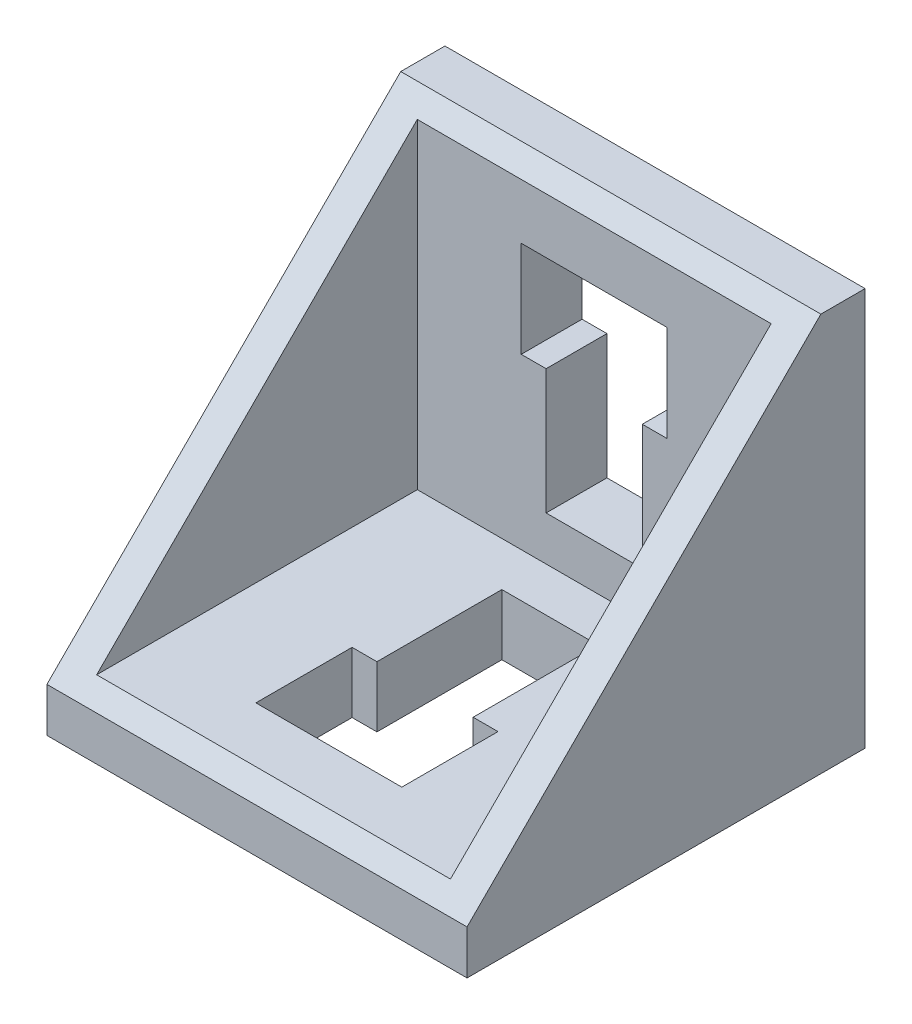
ISO-10303-21;
HEADER;
FILE_DESCRIPTION(('STEP AP214'),'2;1');
FILE_NAME('part.step','',(''),(''),'','','');
FILE_SCHEMA(('AUTOMOTIVE_DESIGN { 1 0 10303 214 1 1 1 1 }'));
ENDSEC;
DATA;
#1=APPLICATION_CONTEXT('core data for automotive mechanical design processes');
#2=APPLICATION_PROTOCOL_DEFINITION('international standard','automotive_design',2000,#1);
#3=PRODUCT_CONTEXT('',#1,'mechanical');
#4=PRODUCT('Part','Part','',(#3));
#5=PRODUCT_RELATED_PRODUCT_CATEGORY('part','',(#4));
#6=PRODUCT_DEFINITION_FORMATION('','',#4);
#7=PRODUCT_DEFINITION_CONTEXT('part definition',#1,'design');
#8=PRODUCT_DEFINITION('design','',#6,#7);
#9=PRODUCT_DEFINITION_SHAPE('','',#8);
#10=(LENGTH_UNIT() NAMED_UNIT(*) SI_UNIT(.MILLI.,.METRE.));
#11=(NAMED_UNIT(*) PLANE_ANGLE_UNIT() SI_UNIT($,.RADIAN.));
#12=(NAMED_UNIT(*) SI_UNIT($,.STERADIAN.) SOLID_ANGLE_UNIT());
#13=UNCERTAINTY_MEASURE_WITH_UNIT(LENGTH_MEASURE(1.E-05),#10,'distance_accuracy_value','');
#14=(GEOMETRIC_REPRESENTATION_CONTEXT(3) GLOBAL_UNCERTAINTY_ASSIGNED_CONTEXT((#13)) GLOBAL_UNIT_ASSIGNED_CONTEXT((#10,
#11,#12)) REPRESENTATION_CONTEXT('',''));
#15=CARTESIAN_POINT('',(0.,0.,0.));
#16=DIRECTION('',(0.,0.,1.));
#17=DIRECTION('',(1.,0.,0.));
#18=AXIS2_PLACEMENT_3D('',#15,#16,#17);
#19=CARTESIAN_POINT('',(38.,20.,-20.));
#20=DIRECTION('',(0.,0.,1.));
#21=DIRECTION('',(0.,-1.,0.));
#22=AXIS2_PLACEMENT_3D('',#19,#20,#21);
#23=PLANE('',#22);
#24=DIRECTION('',(-1.,0.,0.));
#25=VECTOR('',#24,1.);
#26=CARTESIAN_POINT('',(25.6,9.5,-20.));
#27=LINE('',#26,#25);
#28=CARTESIAN_POINT('',(25.6,9.5,-20.));
#29=VERTEX_POINT('',#28);
#30=CARTESIAN_POINT('',(12.4,9.5,-20.));
#31=VERTEX_POINT('',#30);
#32=EDGE_CURVE('E287',#29,#31,#27,.T.);
#33=ORIENTED_EDGE('',*,*,#32,.T.);
#34=DIRECTION('',(0.,-1.,0.));
#35=VECTOR('',#34,1.);
#36=CARTESIAN_POINT('',(12.4,9.5,-20.));
#37=LINE('',#36,#35);
#38=CARTESIAN_POINT('',(12.4,0.799999999999998,-20.));
#39=VERTEX_POINT('',#38);
#40=EDGE_CURVE('E265',#31,#39,#37,.T.);
#41=ORIENTED_EDGE('',*,*,#40,.T.);
#42=DIRECTION('',(1.,0.,0.));
#43=VECTOR('',#42,1.);
#44=CARTESIAN_POINT('',(12.4,0.799999999999998,-20.));
#45=LINE('',#44,#43);
#46=CARTESIAN_POINT('',(14.65,0.799999999999998,-20.));
#47=VERTEX_POINT('',#46);
#48=EDGE_CURVE('E268',#39,#47,#45,.T.);
#49=ORIENTED_EDGE('',*,*,#48,.T.);
#50=DIRECTION('',(0.,-1.,0.));
#51=VECTOR('',#50,1.);
#52=CARTESIAN_POINT('',(14.65,0.799999999999997,-20.));
#53=LINE('',#52,#51);
#54=CARTESIAN_POINT('',(14.65,-10.5,-20.));
#55=VERTEX_POINT('',#54);
#56=EDGE_CURVE('E272',#47,#55,#53,.T.);
#57=ORIENTED_EDGE('',*,*,#56,.T.);
#58=DIRECTION('',(1.,0.,0.));
#59=VECTOR('',#58,1.);
#60=CARTESIAN_POINT('',(14.65,-10.5,-20.));
#61=LINE('',#60,#59);
#62=CARTESIAN_POINT('',(23.35,-10.5,-20.));
#63=VERTEX_POINT('',#62);
#64=EDGE_CURVE('E275',#55,#63,#61,.T.);
#65=ORIENTED_EDGE('',*,*,#64,.T.);
#66=DIRECTION('',(0.,1.,0.));
#67=VECTOR('',#66,1.);
#68=CARTESIAN_POINT('',(23.35,0.799999999999997,-20.));
#69=LINE('',#68,#67);
#70=CARTESIAN_POINT('',(23.35,0.799999999999997,-20.));
#71=VERTEX_POINT('',#70);
#72=EDGE_CURVE('E278',#63,#71,#69,.T.);
#73=ORIENTED_EDGE('',*,*,#72,.T.);
#74=DIRECTION('',(1.,0.,0.));
#75=VECTOR('',#74,1.);
#76=CARTESIAN_POINT('',(25.6,0.799999999999998,-20.));
#77=LINE('',#76,#75);
#78=CARTESIAN_POINT('',(25.6,0.799999999999998,-20.));
#79=VERTEX_POINT('',#78);
#80=EDGE_CURVE('E281',#71,#79,#77,.T.);
#81=ORIENTED_EDGE('',*,*,#80,.T.);
#82=DIRECTION('',(0.,1.,0.));
#83=VECTOR('',#82,1.);
#84=CARTESIAN_POINT('',(25.6,9.5,-20.));
#85=LINE('',#84,#83);
#86=EDGE_CURVE('E284',#79,#29,#85,.T.);
#87=ORIENTED_EDGE('',*,*,#86,.T.);
#88=EDGE_LOOP('',(#33,#41,#49,#57,#65,#73,#81,#87));
#89=FACE_BOUND('',#88,.T.);
#90=DIRECTION('',(-1.,0.,0.));
#91=VECTOR('',#90,1.);
#92=CARTESIAN_POINT('',(38.,16.,-20.));
#93=LINE('',#92,#91);
#94=CARTESIAN_POINT('',(38.,16.,-20.));
#95=VERTEX_POINT('',#94);
#96=CARTESIAN_POINT('',(0.,16.,-20.));
#97=VERTEX_POINT('',#96);
#98=EDGE_CURVE('E331',#95,#97,#93,.T.);
#99=ORIENTED_EDGE('',*,*,#98,.F.);
#100=DIRECTION('',(0.,1.,0.));
#101=VECTOR('',#100,1.);
#102=CARTESIAN_POINT('',(38.,20.,-20.));
#103=LINE('',#102,#101);
#104=CARTESIAN_POINT('',(38.,-20.,-20.));
#105=VERTEX_POINT('',#104);
#106=EDGE_CURVE('E362',#105,#95,#103,.T.);
#107=ORIENTED_EDGE('',*,*,#106,.F.);
#108=DIRECTION('',(-1.,0.,0.));
#109=VECTOR('',#108,1.);
#110=CARTESIAN_POINT('',(38.,-20.,-20.));
#111=LINE('',#110,#109);
#112=CARTESIAN_POINT('',(0.,-20.,-20.));
#113=VERTEX_POINT('',#112);
#114=EDGE_CURVE('E371',#105,#113,#111,.T.);
#115=ORIENTED_EDGE('',*,*,#114,.T.);
#116=DIRECTION('',(0.,1.,0.));
#117=VECTOR('',#116,1.);
#118=CARTESIAN_POINT('',(0.,20.,-20.));
#119=LINE('',#118,#117);
#120=EDGE_CURVE('E361',#113,#97,#119,.T.);
#121=ORIENTED_EDGE('',*,*,#120,.T.);
#122=EDGE_LOOP('',(#99,#107,#115,#121));
#123=FACE_BOUND('',#122,.T.);
#124=ADVANCED_FACE('F36',(#89,#123),#23,.F.);
#125=CARTESIAN_POINT('',(38.,-20.,20.));
#126=DIRECTION('',(0.,-0.707106781186548,-0.707106781186548));
#127=DIRECTION('',(0.,0.707106781186548,-0.707106781186548));
#128=AXIS2_PLACEMENT_3D('',#125,#126,#127);
#129=PLANE('',#128);
#130=DIRECTION('',(1.,0.,0.));
#131=VECTOR('',#130,1.);
#132=CARTESIAN_POINT('',(38.,14.5,-14.5));
#133=LINE('',#132,#131);
#134=CARTESIAN_POINT('',(3.,14.5,-14.5));
#135=VERTEX_POINT('',#134);
#136=CARTESIAN_POINT('',(35.,14.5,-14.5));
#137=VERTEX_POINT('',#136);
#138=EDGE_CURVE('E382',#135,#137,#133,.T.);
#139=ORIENTED_EDGE('',*,*,#138,.T.);
#140=DIRECTION('',(0.,-0.707106781186548,0.707106781186548));
#141=VECTOR('',#140,1.);
#142=CARTESIAN_POINT('',(35.,-20.,20.));
#143=LINE('',#142,#141);
#144=CARTESIAN_POINT('',(35.,-14.5,14.5));
#145=VERTEX_POINT('',#144);
#146=EDGE_CURVE('E12',#137,#145,#143,.T.);
#147=ORIENTED_EDGE('',*,*,#146,.T.);
#148=DIRECTION('',(-1.,0.,0.));
#149=VECTOR('',#148,1.);
#150=CARTESIAN_POINT('',(38.,-14.5,14.5));
#151=LINE('',#150,#149);
#152=CARTESIAN_POINT('',(3.,-14.5,14.5));
#153=VERTEX_POINT('',#152);
#154=EDGE_CURVE('E43',#145,#153,#151,.T.);
#155=ORIENTED_EDGE('',*,*,#154,.T.);
#156=DIRECTION('',(0.,-0.707106781186548,0.707106781186548));
#157=VECTOR('',#156,1.);
#158=CARTESIAN_POINT('',(3.,-20.,20.));
#159=LINE('',#158,#157);
#160=EDGE_CURVE('E380',#135,#153,#159,.T.);
#161=ORIENTED_EDGE('',*,*,#160,.F.);
#162=EDGE_LOOP('',(#139,#147,#155,#161));
#163=FACE_BOUND('',#162,.T.);
#164=DIRECTION('',(-1.,0.,0.));
#165=VECTOR('',#164,1.);
#166=CARTESIAN_POINT('',(38.,16.,-16.));
#167=LINE('',#166,#165);
#168=CARTESIAN_POINT('',(38.,16.,-16.));
#169=VERTEX_POINT('',#168);
#170=CARTESIAN_POINT('',(0.,16.,-16.));
#171=VERTEX_POINT('',#170);
#172=EDGE_CURVE('E337',#169,#171,#167,.T.);
#173=ORIENTED_EDGE('',*,*,#172,.T.);
#174=DIRECTION('',(0.,-0.707106781186548,0.707106781186547));
#175=VECTOR('',#174,1.);
#176=CARTESIAN_POINT('',(0.,-20.,20.));
#177=LINE('',#176,#175);
#178=CARTESIAN_POINT('',(0.,-16.,16.));
#179=VERTEX_POINT('',#178);
#180=EDGE_CURVE('E374',#171,#179,#177,.T.);
#181=ORIENTED_EDGE('',*,*,#180,.T.);
#182=DIRECTION('',(-1.,0.,0.));
#183=VECTOR('',#182,1.);
#184=CARTESIAN_POINT('',(38.,-16.,16.));
#185=LINE('',#184,#183);
#186=CARTESIAN_POINT('',(38.,-16.,16.));
#187=VERTEX_POINT('',#186);
#188=EDGE_CURVE('E343',#187,#179,#185,.T.);
#189=ORIENTED_EDGE('',*,*,#188,.F.);
#190=DIRECTION('',(0.,-0.707106781186548,0.707106781186547));
#191=VECTOR('',#190,1.);
#192=CARTESIAN_POINT('',(38.,-20.,20.));
#193=LINE('',#192,#191);
#194=EDGE_CURVE('E365',#169,#187,#193,.T.);
#195=ORIENTED_EDGE('',*,*,#194,.F.);
#196=EDGE_LOOP('',(#173,#181,#189,#195));
#197=FACE_BOUND('',#196,.T.);
#198=ADVANCED_FACE('F387',(#163,#197),#129,.F.);
#199=CARTESIAN_POINT('',(38.,-20.,20.));
#200=DIRECTION('',(0.,1.,0.));
#201=DIRECTION('',(0.,0.,1.));
#202=AXIS2_PLACEMENT_3D('',#199,#200,#201);
#203=PLANE('',#202);
#204=DIRECTION('',(-1.,0.,0.));
#205=VECTOR('',#204,1.);
#206=CARTESIAN_POINT('',(12.4,-20.,0.79999999999999));
#207=LINE('',#206,#205);
#208=CARTESIAN_POINT('',(14.65,-20.,0.79999999999999));
#209=VERTEX_POINT('',#208);
#210=CARTESIAN_POINT('',(12.4,-20.,0.79999999999999));
#211=VERTEX_POINT('',#210);
#212=EDGE_CURVE('E204',#209,#211,#207,.T.);
#213=ORIENTED_EDGE('',*,*,#212,.T.);
#214=DIRECTION('',(0.,0.,1.));
#215=VECTOR('',#214,1.);
#216=CARTESIAN_POINT('',(12.4,-20.,9.49999999999999));
#217=LINE('',#216,#215);
#218=CARTESIAN_POINT('',(12.4,-20.,9.49999999999999));
#219=VERTEX_POINT('',#218);
#220=EDGE_CURVE('E198',#211,#219,#217,.T.);
#221=ORIENTED_EDGE('',*,*,#220,.T.);
#222=DIRECTION('',(1.,0.,0.));
#223=VECTOR('',#222,1.);
#224=CARTESIAN_POINT('',(25.6,-20.,9.49999999999999));
#225=LINE('',#224,#223);
#226=CARTESIAN_POINT('',(25.6,-20.,9.49999999999999));
#227=VERTEX_POINT('',#226);
#228=EDGE_CURVE('E207',#219,#227,#225,.T.);
#229=ORIENTED_EDGE('',*,*,#228,.T.);
#230=DIRECTION('',(0.,0.,-1.));
#231=VECTOR('',#230,1.);
#232=CARTESIAN_POINT('',(25.6,-20.,9.49999999999999));
#233=LINE('',#232,#231);
#234=CARTESIAN_POINT('',(25.6,-20.,0.79999999999999));
#235=VERTEX_POINT('',#234);
#236=EDGE_CURVE('E50',#227,#235,#233,.T.);
#237=ORIENTED_EDGE('',*,*,#236,.T.);
#238=DIRECTION('',(-1.,0.,0.));
#239=VECTOR('',#238,1.);
#240=CARTESIAN_POINT('',(25.6,-20.,0.79999999999999));
#241=LINE('',#240,#239);
#242=CARTESIAN_POINT('',(23.35,-20.,0.79999999999999));
#243=VERTEX_POINT('',#242);
#244=EDGE_CURVE('E222',#235,#243,#241,.T.);
#245=ORIENTED_EDGE('',*,*,#244,.T.);
#246=DIRECTION('',(0.,0.,-1.));
#247=VECTOR('',#246,1.);
#248=CARTESIAN_POINT('',(23.35,-20.,0.79999999999999));
#249=LINE('',#248,#247);
#250=CARTESIAN_POINT('',(23.35,-20.,-10.5));
#251=VERTEX_POINT('',#250);
#252=EDGE_CURVE('E225',#243,#251,#249,.T.);
#253=ORIENTED_EDGE('',*,*,#252,.T.);
#254=DIRECTION('',(-1.,0.,0.));
#255=VECTOR('',#254,1.);
#256=CARTESIAN_POINT('',(14.65,-20.,-10.5));
#257=LINE('',#256,#255);
#258=CARTESIAN_POINT('',(14.65,-20.,-10.5));
#259=VERTEX_POINT('',#258);
#260=EDGE_CURVE('E228',#251,#259,#257,.T.);
#261=ORIENTED_EDGE('',*,*,#260,.T.);
#262=DIRECTION('',(0.,0.,1.));
#263=VECTOR('',#262,1.);
#264=CARTESIAN_POINT('',(14.65,-20.,0.79999999999999));
#265=LINE('',#264,#263);
#266=EDGE_CURVE('E231',#259,#209,#265,.T.);
#267=ORIENTED_EDGE('',*,*,#266,.T.);
#268=EDGE_LOOP('',(#213,#221,#229,#237,#245,#253,#261,#267));
#269=FACE_BOUND('',#268,.T.);
#270=DIRECTION('',(-1.,0.,0.));
#271=VECTOR('',#270,1.);
#272=CARTESIAN_POINT('',(38.,-20.,16.));
#273=LINE('',#272,#271);
#274=CARTESIAN_POINT('',(38.,-20.,16.));
#275=VERTEX_POINT('',#274);
#276=CARTESIAN_POINT('',(0.,-20.,16.));
#277=VERTEX_POINT('',#276);
#278=EDGE_CURVE('E335',#275,#277,#273,.T.);
#279=ORIENTED_EDGE('',*,*,#278,.T.);
#280=DIRECTION('',(0.,0.,-1.));
#281=VECTOR('',#280,1.);
#282=CARTESIAN_POINT('',(0.,-20.,20.));
#283=LINE('',#282,#281);
#284=EDGE_CURVE('E366',#277,#113,#283,.T.);
#285=ORIENTED_EDGE('',*,*,#284,.T.);
#286=ORIENTED_EDGE('',*,*,#114,.F.);
#287=DIRECTION('',(0.,0.,-1.));
#288=VECTOR('',#287,1.);
#289=CARTESIAN_POINT('',(38.,-20.,20.));
#290=LINE('',#289,#288);
#291=EDGE_CURVE('E369',#275,#105,#290,.T.);
#292=ORIENTED_EDGE('',*,*,#291,.F.);
#293=EDGE_LOOP('',(#279,#285,#286,#292));
#294=FACE_BOUND('',#293,.T.);
#295=ADVANCED_FACE('F211',(#269,#294),#203,.F.);
#296=CARTESIAN_POINT('',(38.,0.,0.));
#297=DIRECTION('',(1.,0.,0.));
#298=DIRECTION('',(0.,0.,-1.));
#299=AXIS2_PLACEMENT_3D('',#296,#297,#298);
#300=PLANE('',#299);
#301=ORIENTED_EDGE('',*,*,#106,.T.);
#302=DIRECTION('',(0.,0.,-1.));
#303=VECTOR('',#302,1.);
#304=CARTESIAN_POINT('',(38.,16.,-16.));
#305=LINE('',#304,#303);
#306=EDGE_CURVE('E329',#169,#95,#305,.T.);
#307=ORIENTED_EDGE('',*,*,#306,.F.);
#308=ORIENTED_EDGE('',*,*,#194,.T.);
#309=DIRECTION('',(0.,1.,0.));
#310=VECTOR('',#309,1.);
#311=CARTESIAN_POINT('',(38.,-16.,16.));
#312=LINE('',#311,#310);
#313=EDGE_CURVE('E341',#275,#187,#312,.T.);
#314=ORIENTED_EDGE('',*,*,#313,.F.);
#315=ORIENTED_EDGE('',*,*,#291,.T.);
#316=EDGE_LOOP('',(#301,#307,#308,#314,#315));
#317=FACE_BOUND('',#316,.T.);
#318=ADVANCED_FACE('F426',(#317),#300,.T.);
#319=CARTESIAN_POINT('',(0.,0.,0.));
#320=DIRECTION('',(1.,0.,0.));
#321=DIRECTION('',(0.,0.,-1.));
#322=AXIS2_PLACEMENT_3D('',#319,#320,#321);
#323=PLANE('',#322);
#324=DIRECTION('',(0.,0.,-1.));
#325=VECTOR('',#324,1.);
#326=CARTESIAN_POINT('',(0.,16.,-16.));
#327=LINE('',#326,#325);
#328=EDGE_CURVE('E332',#171,#97,#327,.T.);
#329=ORIENTED_EDGE('',*,*,#328,.T.);
#330=ORIENTED_EDGE('',*,*,#120,.F.);
#331=ORIENTED_EDGE('',*,*,#284,.F.);
#332=DIRECTION('',(0.,1.,0.));
#333=VECTOR('',#332,1.);
#334=CARTESIAN_POINT('',(0.,-16.,16.));
#335=LINE('',#334,#333);
#336=EDGE_CURVE('E314',#277,#179,#335,.T.);
#337=ORIENTED_EDGE('',*,*,#336,.T.);
#338=ORIENTED_EDGE('',*,*,#180,.F.);
#339=EDGE_LOOP('',(#329,#330,#331,#337,#338));
#340=FACE_BOUND('',#339,.T.);
#341=ADVANCED_FACE('F433',(#340),#323,.F.);
#342=CARTESIAN_POINT('',(-48.7903679018718,-14.5,20.));
#343=DIRECTION('',(0.,-1.,0.));
#344=DIRECTION('',(0.,0.,-1.));
#345=AXIS2_PLACEMENT_3D('',#342,#343,#344);
#346=PLANE('',#345);
#347=DIRECTION('',(1.,0.,0.));
#348=VECTOR('',#347,1.);
#349=CARTESIAN_POINT('',(25.6,-14.5,9.49999999999999));
#350=LINE('',#349,#348);
#351=CARTESIAN_POINT('',(12.4,-14.5,9.49999999999999));
#352=VERTEX_POINT('',#351);
#353=CARTESIAN_POINT('',(25.6,-14.5,9.49999999999999));
#354=VERTEX_POINT('',#353);
#355=EDGE_CURVE('E235',#352,#354,#350,.T.);
#356=ORIENTED_EDGE('',*,*,#355,.F.);
#357=DIRECTION('',(0.,0.,1.));
#358=VECTOR('',#357,1.);
#359=CARTESIAN_POINT('',(12.4,-14.5,9.49999999999999));
#360=LINE('',#359,#358);
#361=CARTESIAN_POINT('',(12.4,-14.5,0.79999999999999));
#362=VERTEX_POINT('',#361);
#363=EDGE_CURVE('E58',#362,#352,#360,.T.);
#364=ORIENTED_EDGE('',*,*,#363,.F.);
#365=DIRECTION('',(-1.,0.,0.));
#366=VECTOR('',#365,1.);
#367=CARTESIAN_POINT('',(12.4,-14.5,0.79999999999999));
#368=LINE('',#367,#366);
#369=CARTESIAN_POINT('',(14.65,-14.5,0.79999999999999));
#370=VERTEX_POINT('',#369);
#371=EDGE_CURVE('E215',#370,#362,#368,.T.);
#372=ORIENTED_EDGE('',*,*,#371,.F.);
#373=DIRECTION('',(0.,0.,1.));
#374=VECTOR('',#373,1.);
#375=CARTESIAN_POINT('',(14.65,-14.5,0.79999999999999));
#376=LINE('',#375,#374);
#377=CARTESIAN_POINT('',(14.65,-14.5,-10.5));
#378=VERTEX_POINT('',#377);
#379=EDGE_CURVE('E218',#378,#370,#376,.T.);
#380=ORIENTED_EDGE('',*,*,#379,.F.);
#381=DIRECTION('',(-1.,0.,0.));
#382=VECTOR('',#381,1.);
#383=CARTESIAN_POINT('',(14.65,-14.5,-10.5));
#384=LINE('',#383,#382);
#385=CARTESIAN_POINT('',(23.35,-14.5,-10.5));
#386=VERTEX_POINT('',#385);
#387=EDGE_CURVE('E246',#386,#378,#384,.T.);
#388=ORIENTED_EDGE('',*,*,#387,.F.);
#389=DIRECTION('',(0.,0.,-1.));
#390=VECTOR('',#389,1.);
#391=CARTESIAN_POINT('',(23.35,-14.5,0.79999999999999));
#392=LINE('',#391,#390);
#393=CARTESIAN_POINT('',(23.35,-14.5,0.79999999999999));
#394=VERTEX_POINT('',#393);
#395=EDGE_CURVE('E243',#394,#386,#392,.T.);
#396=ORIENTED_EDGE('',*,*,#395,.F.);
#397=DIRECTION('',(-1.,0.,0.));
#398=VECTOR('',#397,1.);
#399=CARTESIAN_POINT('',(25.6,-14.5,0.79999999999999));
#400=LINE('',#399,#398);
#401=CARTESIAN_POINT('',(25.6,-14.5,0.79999999999999));
#402=VERTEX_POINT('',#401);
#403=EDGE_CURVE('E240',#402,#394,#400,.T.);
#404=ORIENTED_EDGE('',*,*,#403,.F.);
#405=DIRECTION('',(0.,0.,-1.));
#406=VECTOR('',#405,1.);
#407=CARTESIAN_POINT('',(25.6,-14.5,9.49999999999999));
#408=LINE('',#407,#406);
#409=EDGE_CURVE('E237',#354,#402,#408,.T.);
#410=ORIENTED_EDGE('',*,*,#409,.F.);
#411=EDGE_LOOP('',(#356,#364,#372,#380,#388,#396,#404,#410));
#412=FACE_BOUND('',#411,.T.);
#413=DIRECTION('',(0.,0.,-1.));
#414=VECTOR('',#413,1.);
#415=CARTESIAN_POINT('',(35.,-14.5,20.));
#416=LINE('',#415,#414);
#417=CARTESIAN_POINT('',(35.,-14.5,-14.5));
#418=VERTEX_POINT('',#417);
#419=EDGE_CURVE('E340',#145,#418,#416,.T.);
#420=ORIENTED_EDGE('',*,*,#419,.T.);
#421=DIRECTION('',(1.,0.,0.));
#422=VECTOR('',#421,1.);
#423=CARTESIAN_POINT('',(-48.7903679018718,-14.5,-14.5));
#424=LINE('',#423,#422);
#425=CARTESIAN_POINT('',(3.,-14.5,-14.5));
#426=VERTEX_POINT('',#425);
#427=EDGE_CURVE('E353',#426,#418,#424,.T.);
#428=ORIENTED_EDGE('',*,*,#427,.F.);
#429=DIRECTION('',(0.,0.,1.));
#430=VECTOR('',#429,1.);
#431=CARTESIAN_POINT('',(3.,-14.5,20.));
#432=LINE('',#431,#430);
#433=EDGE_CURVE('E349',#426,#153,#432,.T.);
#434=ORIENTED_EDGE('',*,*,#433,.T.);
#435=ORIENTED_EDGE('',*,*,#154,.F.);
#436=EDGE_LOOP('',(#420,#428,#434,#435));
#437=FACE_BOUND('',#436,.T.);
#438=ADVANCED_FACE('F391',(#412,#437),#346,.F.);
#439=CARTESIAN_POINT('',(-48.7903679018718,-14.5,-14.5));
#440=DIRECTION('',(0.,0.,-1.));
#441=DIRECTION('',(0.,1.,0.));
#442=AXIS2_PLACEMENT_3D('',#439,#440,#441);
#443=PLANE('',#442);
#444=DIRECTION('',(1.,0.,0.));
#445=VECTOR('',#444,1.);
#446=CARTESIAN_POINT('',(12.4,0.799999999999998,-14.5));
#447=LINE('',#446,#445);
#448=CARTESIAN_POINT('',(12.4,0.799999999999998,-14.5));
#449=VERTEX_POINT('',#448);
#450=CARTESIAN_POINT('',(14.65,0.799999999999997,-14.5));
#451=VERTEX_POINT('',#450);
#452=EDGE_CURVE('E292',#449,#451,#447,.T.);
#453=ORIENTED_EDGE('',*,*,#452,.F.);
#454=DIRECTION('',(0.,-1.,0.));
#455=VECTOR('',#454,1.);
#456=CARTESIAN_POINT('',(12.4,9.5,-14.5));
#457=LINE('',#456,#455);
#458=CARTESIAN_POINT('',(12.4,9.5,-14.5));
#459=VERTEX_POINT('',#458);
#460=EDGE_CURVE('E253',#459,#449,#457,.T.);
#461=ORIENTED_EDGE('',*,*,#460,.F.);
#462=DIRECTION('',(-1.,0.,0.));
#463=VECTOR('',#462,1.);
#464=CARTESIAN_POINT('',(25.6,9.5,-14.5));
#465=LINE('',#464,#463);
#466=CARTESIAN_POINT('',(25.6,9.5,-14.5));
#467=VERTEX_POINT('',#466);
#468=EDGE_CURVE('E269',#467,#459,#465,.T.);
#469=ORIENTED_EDGE('',*,*,#468,.F.);
#470=DIRECTION('',(0.,1.,0.));
#471=VECTOR('',#470,1.);
#472=CARTESIAN_POINT('',(25.6,9.5,-14.5));
#473=LINE('',#472,#471);
#474=CARTESIAN_POINT('',(25.6,0.799999999999998,-14.5));
#475=VERTEX_POINT('',#474);
#476=EDGE_CURVE('E307',#475,#467,#473,.T.);
#477=ORIENTED_EDGE('',*,*,#476,.F.);
#478=DIRECTION('',(1.,0.,0.));
#479=VECTOR('',#478,1.);
#480=CARTESIAN_POINT('',(25.6,0.799999999999998,-14.5));
#481=LINE('',#480,#479);
#482=CARTESIAN_POINT('',(23.35,0.799999999999997,-14.5));
#483=VERTEX_POINT('',#482);
#484=EDGE_CURVE('E304',#483,#475,#481,.T.);
#485=ORIENTED_EDGE('',*,*,#484,.F.);
#486=DIRECTION('',(0.,1.,0.));
#487=VECTOR('',#486,1.);
#488=CARTESIAN_POINT('',(23.35,0.799999999999997,-14.5));
#489=LINE('',#488,#487);
#490=CARTESIAN_POINT('',(23.35,-10.5,-14.5));
#491=VERTEX_POINT('',#490);
#492=EDGE_CURVE('E301',#491,#483,#489,.T.);
#493=ORIENTED_EDGE('',*,*,#492,.F.);
#494=DIRECTION('',(1.,0.,0.));
#495=VECTOR('',#494,1.);
#496=CARTESIAN_POINT('',(14.65,-10.5,-14.5));
#497=LINE('',#496,#495);
#498=CARTESIAN_POINT('',(14.65,-10.5,-14.5));
#499=VERTEX_POINT('',#498);
#500=EDGE_CURVE('E298',#499,#491,#497,.T.);
#501=ORIENTED_EDGE('',*,*,#500,.F.);
#502=DIRECTION('',(0.,-1.,0.));
#503=VECTOR('',#502,1.);
#504=CARTESIAN_POINT('',(14.65,0.799999999999997,-14.5));
#505=LINE('',#504,#503);
#506=EDGE_CURVE('E295',#451,#499,#505,.T.);
#507=ORIENTED_EDGE('',*,*,#506,.F.);
#508=EDGE_LOOP('',(#453,#461,#469,#477,#485,#493,#501,#507));
#509=FACE_BOUND('',#508,.T.);
#510=DIRECTION('',(0.,-1.,0.));
#511=VECTOR('',#510,1.);
#512=CARTESIAN_POINT('',(3.,-14.5,-14.5));
#513=LINE('',#512,#511);
#514=EDGE_CURVE('E352',#135,#426,#513,.T.);
#515=ORIENTED_EDGE('',*,*,#514,.T.);
#516=ORIENTED_EDGE('',*,*,#427,.T.);
#517=DIRECTION('',(0.,1.,0.));
#518=VECTOR('',#517,1.);
#519=CARTESIAN_POINT('',(35.,-14.5,-14.5));
#520=LINE('',#519,#518);
#521=EDGE_CURVE('E355',#418,#137,#520,.T.);
#522=ORIENTED_EDGE('',*,*,#521,.T.);
#523=ORIENTED_EDGE('',*,*,#138,.F.);
#524=EDGE_LOOP('',(#515,#516,#522,#523));
#525=FACE_BOUND('',#524,.T.);
#526=ADVANCED_FACE('F399',(#509,#525),#443,.F.);
#527=CARTESIAN_POINT('',(35.,0.,0.));
#528=DIRECTION('',(1.,0.,0.));
#529=DIRECTION('',(0.,0.,-1.));
#530=AXIS2_PLACEMENT_3D('',#527,#528,#529);
#531=PLANE('',#530);
#532=ORIENTED_EDGE('',*,*,#521,.F.);
#533=ORIENTED_EDGE('',*,*,#419,.F.);
#534=ORIENTED_EDGE('',*,*,#146,.F.);
#535=EDGE_LOOP('',(#532,#533,#534));
#536=FACE_BOUND('',#535,.T.);
#537=ADVANCED_FACE('F396',(#536),#531,.F.);
#538=CARTESIAN_POINT('',(3.,0.,0.));
#539=DIRECTION('',(1.,0.,0.));
#540=DIRECTION('',(0.,0.,-1.));
#541=AXIS2_PLACEMENT_3D('',#538,#539,#540);
#542=PLANE('',#541);
#543=ORIENTED_EDGE('',*,*,#160,.T.);
#544=ORIENTED_EDGE('',*,*,#433,.F.);
#545=ORIENTED_EDGE('',*,*,#514,.F.);
#546=EDGE_LOOP('',(#543,#544,#545));
#547=FACE_BOUND('',#546,.T.);
#548=ADVANCED_FACE('F401',(#547),#542,.T.);
#549=CARTESIAN_POINT('',(38.,-16.,16.));
#550=DIRECTION('',(0.,0.,1.));
#551=DIRECTION('',(1.,0.,0.));
#552=AXIS2_PLACEMENT_3D('',#549,#550,#551);
#553=PLANE('',#552);
#554=ORIENTED_EDGE('',*,*,#336,.F.);
#555=ORIENTED_EDGE('',*,*,#278,.F.);
#556=ORIENTED_EDGE('',*,*,#313,.T.);
#557=ORIENTED_EDGE('',*,*,#188,.T.);
#558=EDGE_LOOP('',(#554,#555,#556,#557));
#559=FACE_BOUND('',#558,.T.);
#560=ADVANCED_FACE('F403',(#559),#553,.T.);
#561=CARTESIAN_POINT('',(38.,16.,-16.));
#562=DIRECTION('',(0.,1.,0.));
#563=DIRECTION('',(0.,0.,1.));
#564=AXIS2_PLACEMENT_3D('',#561,#562,#563);
#565=PLANE('',#564);
#566=ORIENTED_EDGE('',*,*,#328,.F.);
#567=ORIENTED_EDGE('',*,*,#172,.F.);
#568=ORIENTED_EDGE('',*,*,#306,.T.);
#569=ORIENTED_EDGE('',*,*,#98,.T.);
#570=EDGE_LOOP('',(#566,#567,#568,#569));
#571=FACE_BOUND('',#570,.T.);
#572=ADVANCED_FACE('F409',(#571),#565,.T.);
#573=CARTESIAN_POINT('',(12.4,9.5,-20.));
#574=DIRECTION('',(-1.,0.,0.));
#575=DIRECTION('',(0.,-1.,0.));
#576=AXIS2_PLACEMENT_3D('',#573,#574,#575);
#577=PLANE('',#576);
#578=ORIENTED_EDGE('',*,*,#460,.T.);
#579=DIRECTION('',(0.,0.,1.));
#580=VECTOR('',#579,1.);
#581=CARTESIAN_POINT('',(12.4,0.799999999999998,-20.));
#582=LINE('',#581,#580);
#583=EDGE_CURVE('E290',#39,#449,#582,.T.);
#584=ORIENTED_EDGE('',*,*,#583,.F.);
#585=ORIENTED_EDGE('',*,*,#40,.F.);
#586=DIRECTION('',(0.,0.,1.));
#587=VECTOR('',#586,1.);
#588=CARTESIAN_POINT('',(12.4,9.5,-20.));
#589=LINE('',#588,#587);
#590=EDGE_CURVE('E312',#31,#459,#589,.T.);
#591=ORIENTED_EDGE('',*,*,#590,.T.);
#592=EDGE_LOOP('',(#578,#584,#585,#591));
#593=FACE_BOUND('',#592,.T.);
#594=ADVANCED_FACE('F437',(#593),#577,.F.);
#595=CARTESIAN_POINT('',(25.6,9.5,-20.));
#596=DIRECTION('',(0.,1.,0.));
#597=DIRECTION('',(0.,0.,1.));
#598=AXIS2_PLACEMENT_3D('',#595,#596,#597);
#599=PLANE('',#598);
#600=ORIENTED_EDGE('',*,*,#468,.T.);
#601=ORIENTED_EDGE('',*,*,#590,.F.);
#602=ORIENTED_EDGE('',*,*,#32,.F.);
#603=DIRECTION('',(0.,0.,1.));
#604=VECTOR('',#603,1.);
#605=CARTESIAN_POINT('',(25.6,9.5,-20.));
#606=LINE('',#605,#604);
#607=EDGE_CURVE('E315',#29,#467,#606,.T.);
#608=ORIENTED_EDGE('',*,*,#607,.T.);
#609=EDGE_LOOP('',(#600,#601,#602,#608));
#610=FACE_BOUND('',#609,.T.);
#611=ADVANCED_FACE('F442',(#610),#599,.F.);
#612=CARTESIAN_POINT('',(25.6,9.5,-20.));
#613=DIRECTION('',(1.,0.,0.));
#614=DIRECTION('',(0.,0.,-1.));
#615=AXIS2_PLACEMENT_3D('',#612,#613,#614);
#616=PLANE('',#615);
#617=ORIENTED_EDGE('',*,*,#476,.T.);
#618=ORIENTED_EDGE('',*,*,#607,.F.);
#619=ORIENTED_EDGE('',*,*,#86,.F.);
#620=DIRECTION('',(0.,0.,1.));
#621=VECTOR('',#620,1.);
#622=CARTESIAN_POINT('',(25.6,0.799999999999998,-20.));
#623=LINE('',#622,#621);
#624=EDGE_CURVE('E317',#79,#475,#623,.T.);
#625=ORIENTED_EDGE('',*,*,#624,.T.);
#626=EDGE_LOOP('',(#617,#618,#619,#625));
#627=FACE_BOUND('',#626,.T.);
#628=ADVANCED_FACE('F465',(#627),#616,.F.);
#629=CARTESIAN_POINT('',(25.6,0.799999999999998,-20.));
#630=DIRECTION('',(0.,-1.,0.));
#631=DIRECTION('',(1.,0.,0.));
#632=AXIS2_PLACEMENT_3D('',#629,#630,#631);
#633=PLANE('',#632);
#634=ORIENTED_EDGE('',*,*,#484,.T.);
#635=ORIENTED_EDGE('',*,*,#624,.F.);
#636=ORIENTED_EDGE('',*,*,#80,.F.);
#637=DIRECTION('',(0.,0.,1.));
#638=VECTOR('',#637,1.);
#639=CARTESIAN_POINT('',(23.35,0.799999999999997,-20.));
#640=LINE('',#639,#638);
#641=EDGE_CURVE('E319',#71,#483,#640,.T.);
#642=ORIENTED_EDGE('',*,*,#641,.T.);
#643=EDGE_LOOP('',(#634,#635,#636,#642));
#644=FACE_BOUND('',#643,.T.);
#645=ADVANCED_FACE('F461',(#644),#633,.F.);
#646=CARTESIAN_POINT('',(23.35,0.799999999999997,-20.));
#647=DIRECTION('',(1.,0.,0.));
#648=DIRECTION('',(0.,1.,0.));
#649=AXIS2_PLACEMENT_3D('',#646,#647,#648);
#650=PLANE('',#649);
#651=ORIENTED_EDGE('',*,*,#492,.T.);
#652=ORIENTED_EDGE('',*,*,#641,.F.);
#653=ORIENTED_EDGE('',*,*,#72,.F.);
#654=DIRECTION('',(0.,0.,1.));
#655=VECTOR('',#654,1.);
#656=CARTESIAN_POINT('',(23.35,-10.5,-20.));
#657=LINE('',#656,#655);
#658=EDGE_CURVE('E321',#63,#491,#657,.T.);
#659=ORIENTED_EDGE('',*,*,#658,.T.);
#660=EDGE_LOOP('',(#651,#652,#653,#659));
#661=FACE_BOUND('',#660,.T.);
#662=ADVANCED_FACE('F457',(#661),#650,.F.);
#663=CARTESIAN_POINT('',(14.65,-10.5,-20.));
#664=DIRECTION('',(0.,-1.,0.));
#665=DIRECTION('',(0.,0.,-1.));
#666=AXIS2_PLACEMENT_3D('',#663,#664,#665);
#667=PLANE('',#666);
#668=ORIENTED_EDGE('',*,*,#500,.T.);
#669=ORIENTED_EDGE('',*,*,#658,.F.);
#670=ORIENTED_EDGE('',*,*,#64,.F.);
#671=DIRECTION('',(0.,0.,1.));
#672=VECTOR('',#671,1.);
#673=CARTESIAN_POINT('',(14.65,-10.5,-20.));
#674=LINE('',#673,#672);
#675=EDGE_CURVE('E323',#55,#499,#674,.T.);
#676=ORIENTED_EDGE('',*,*,#675,.T.);
#677=EDGE_LOOP('',(#668,#669,#670,#676));
#678=FACE_BOUND('',#677,.T.);
#679=ADVANCED_FACE('F453',(#678),#667,.F.);
#680=CARTESIAN_POINT('',(14.65,0.799999999999997,-20.));
#681=DIRECTION('',(-1.,0.,0.));
#682=DIRECTION('',(0.,-1.,0.));
#683=AXIS2_PLACEMENT_3D('',#680,#681,#682);
#684=PLANE('',#683);
#685=ORIENTED_EDGE('',*,*,#506,.T.);
#686=ORIENTED_EDGE('',*,*,#675,.F.);
#687=ORIENTED_EDGE('',*,*,#56,.F.);
#688=DIRECTION('',(0.,0.,1.));
#689=VECTOR('',#688,1.);
#690=CARTESIAN_POINT('',(14.65,0.799999999999997,-20.));
#691=LINE('',#690,#689);
#692=EDGE_CURVE('E325',#47,#451,#691,.T.);
#693=ORIENTED_EDGE('',*,*,#692,.T.);
#694=EDGE_LOOP('',(#685,#686,#687,#693));
#695=FACE_BOUND('',#694,.T.);
#696=ADVANCED_FACE('F449',(#695),#684,.F.);
#697=CARTESIAN_POINT('',(12.4,0.799999999999998,-20.));
#698=DIRECTION('',(0.,-1.,0.));
#699=DIRECTION('',(1.,0.,0.));
#700=AXIS2_PLACEMENT_3D('',#697,#698,#699);
#701=PLANE('',#700);
#702=ORIENTED_EDGE('',*,*,#452,.T.);
#703=ORIENTED_EDGE('',*,*,#692,.F.);
#704=ORIENTED_EDGE('',*,*,#48,.F.);
#705=ORIENTED_EDGE('',*,*,#583,.T.);
#706=EDGE_LOOP('',(#702,#703,#704,#705));
#707=FACE_BOUND('',#706,.T.);
#708=ADVANCED_FACE('F446',(#707),#701,.F.);
#709=CARTESIAN_POINT('',(12.4,-20.,9.49999999999999));
#710=DIRECTION('',(-1.,0.,0.));
#711=DIRECTION('',(0.,0.,1.));
#712=AXIS2_PLACEMENT_3D('',#709,#710,#711);
#713=PLANE('',#712);
#714=ORIENTED_EDGE('',*,*,#363,.T.);
#715=DIRECTION('',(0.,1.,0.));
#716=VECTOR('',#715,1.);
#717=CARTESIAN_POINT('',(12.4,-20.,9.49999999999999));
#718=LINE('',#717,#716);
#719=EDGE_CURVE('E194',#219,#352,#718,.T.);
#720=ORIENTED_EDGE('',*,*,#719,.F.);
#721=ORIENTED_EDGE('',*,*,#220,.F.);
#722=DIRECTION('',(0.,1.,0.));
#723=VECTOR('',#722,1.);
#724=CARTESIAN_POINT('',(12.4,-20.,0.79999999999999));
#725=LINE('',#724,#723);
#726=EDGE_CURVE('E251',#211,#362,#725,.T.);
#727=ORIENTED_EDGE('',*,*,#726,.T.);
#728=EDGE_LOOP('',(#714,#720,#721,#727));
#729=FACE_BOUND('',#728,.T.);
#730=ADVANCED_FACE('F196',(#729),#713,.F.);
#731=CARTESIAN_POINT('',(12.4,-20.,0.79999999999999));
#732=DIRECTION('',(0.,0.,-1.));
#733=DIRECTION('',(-1.,0.,0.));
#734=AXIS2_PLACEMENT_3D('',#731,#732,#733);
#735=PLANE('',#734);
#736=ORIENTED_EDGE('',*,*,#371,.T.);
#737=ORIENTED_EDGE('',*,*,#726,.F.);
#738=ORIENTED_EDGE('',*,*,#212,.F.);
#739=DIRECTION('',(0.,1.,0.));
#740=VECTOR('',#739,1.);
#741=CARTESIAN_POINT('',(14.65,-20.,0.79999999999999));
#742=LINE('',#741,#740);
#743=EDGE_CURVE('E254',#209,#370,#742,.T.);
#744=ORIENTED_EDGE('',*,*,#743,.T.);
#745=EDGE_LOOP('',(#736,#737,#738,#744));
#746=FACE_BOUND('',#745,.T.);
#747=ADVANCED_FACE('F475',(#746),#735,.F.);
#748=CARTESIAN_POINT('',(14.65,-20.,0.79999999999999));
#749=DIRECTION('',(-1.,0.,0.));
#750=DIRECTION('',(0.,0.,1.));
#751=AXIS2_PLACEMENT_3D('',#748,#749,#750);
#752=PLANE('',#751);
#753=ORIENTED_EDGE('',*,*,#379,.T.);
#754=ORIENTED_EDGE('',*,*,#743,.F.);
#755=ORIENTED_EDGE('',*,*,#266,.F.);
#756=DIRECTION('',(0.,1.,0.));
#757=VECTOR('',#756,1.);
#758=CARTESIAN_POINT('',(14.65,-20.,-10.5));
#759=LINE('',#758,#757);
#760=EDGE_CURVE('E256',#259,#378,#759,.T.);
#761=ORIENTED_EDGE('',*,*,#760,.T.);
#762=EDGE_LOOP('',(#753,#754,#755,#761));
#763=FACE_BOUND('',#762,.T.);
#764=ADVANCED_FACE('F492',(#763),#752,.F.);
#765=CARTESIAN_POINT('',(14.65,-20.,-10.5));
#766=DIRECTION('',(0.,0.,-1.));
#767=DIRECTION('',(-1.,0.,0.));
#768=AXIS2_PLACEMENT_3D('',#765,#766,#767);
#769=PLANE('',#768);
#770=ORIENTED_EDGE('',*,*,#387,.T.);
#771=ORIENTED_EDGE('',*,*,#760,.F.);
#772=ORIENTED_EDGE('',*,*,#260,.F.);
#773=DIRECTION('',(0.,1.,0.));
#774=VECTOR('',#773,1.);
#775=CARTESIAN_POINT('',(23.35,-20.,-10.5));
#776=LINE('',#775,#774);
#777=EDGE_CURVE('E258',#251,#386,#776,.T.);
#778=ORIENTED_EDGE('',*,*,#777,.T.);
#779=EDGE_LOOP('',(#770,#771,#772,#778));
#780=FACE_BOUND('',#779,.T.);
#781=ADVANCED_FACE('F488',(#780),#769,.F.);
#782=CARTESIAN_POINT('',(23.35,-20.,0.79999999999999));
#783=DIRECTION('',(1.,0.,0.));
#784=DIRECTION('',(0.,0.,-1.));
#785=AXIS2_PLACEMENT_3D('',#782,#783,#784);
#786=PLANE('',#785);
#787=ORIENTED_EDGE('',*,*,#395,.T.);
#788=ORIENTED_EDGE('',*,*,#777,.F.);
#789=ORIENTED_EDGE('',*,*,#252,.F.);
#790=DIRECTION('',(0.,1.,0.));
#791=VECTOR('',#790,1.);
#792=CARTESIAN_POINT('',(23.35,-20.,0.79999999999999));
#793=LINE('',#792,#791);
#794=EDGE_CURVE('E260',#243,#394,#793,.T.);
#795=ORIENTED_EDGE('',*,*,#794,.T.);
#796=EDGE_LOOP('',(#787,#788,#789,#795));
#797=FACE_BOUND('',#796,.T.);
#798=ADVANCED_FACE('F484',(#797),#786,.F.);
#799=CARTESIAN_POINT('',(25.6,-20.,0.79999999999999));
#800=DIRECTION('',(0.,0.,-1.));
#801=DIRECTION('',(-1.,0.,0.));
#802=AXIS2_PLACEMENT_3D('',#799,#800,#801);
#803=PLANE('',#802);
#804=ORIENTED_EDGE('',*,*,#403,.T.);
#805=ORIENTED_EDGE('',*,*,#794,.F.);
#806=ORIENTED_EDGE('',*,*,#244,.F.);
#807=DIRECTION('',(0.,1.,0.));
#808=VECTOR('',#807,1.);
#809=CARTESIAN_POINT('',(25.6,-20.,0.79999999999999));
#810=LINE('',#809,#808);
#811=EDGE_CURVE('E262',#235,#402,#810,.T.);
#812=ORIENTED_EDGE('',*,*,#811,.T.);
#813=EDGE_LOOP('',(#804,#805,#806,#812));
#814=FACE_BOUND('',#813,.T.);
#815=ADVANCED_FACE('F481',(#814),#803,.F.);
#816=CARTESIAN_POINT('',(25.6,-20.,9.49999999999999));
#817=DIRECTION('',(1.,0.,0.));
#818=DIRECTION('',(0.,0.,-1.));
#819=AXIS2_PLACEMENT_3D('',#816,#817,#818);
#820=PLANE('',#819);
#821=ORIENTED_EDGE('',*,*,#409,.T.);
#822=ORIENTED_EDGE('',*,*,#811,.F.);
#823=ORIENTED_EDGE('',*,*,#236,.F.);
#824=DIRECTION('',(0.,1.,0.));
#825=VECTOR('',#824,1.);
#826=CARTESIAN_POINT('',(25.6,-20.,9.49999999999999));
#827=LINE('',#826,#825);
#828=EDGE_CURVE('E203',#227,#354,#827,.T.);
#829=ORIENTED_EDGE('',*,*,#828,.T.);
#830=EDGE_LOOP('',(#821,#822,#823,#829));
#831=FACE_BOUND('',#830,.T.);
#832=ADVANCED_FACE('F478',(#831),#820,.F.);
#833=CARTESIAN_POINT('',(25.6,-20.,9.49999999999999));
#834=DIRECTION('',(0.,0.,1.));
#835=DIRECTION('',(1.,0.,0.));
#836=AXIS2_PLACEMENT_3D('',#833,#834,#835);
#837=PLANE('',#836);
#838=ORIENTED_EDGE('',*,*,#355,.T.);
#839=ORIENTED_EDGE('',*,*,#828,.F.);
#840=ORIENTED_EDGE('',*,*,#228,.F.);
#841=ORIENTED_EDGE('',*,*,#719,.T.);
#842=EDGE_LOOP('',(#838,#839,#840,#841));
#843=FACE_BOUND('',#842,.T.);
#844=ADVANCED_FACE('F208',(#843),#837,.F.);
#845=CLOSED_SHELL('',(#124,#198,#295,#318,#341,#438,#526,#537,#548,#560,#572,#594,#611,#628,
#645,#662,#679,#696,#708,#730,#747,#764,#781,#798,#815,#832,#844));
#846=MANIFOLD_SOLID_BREP('B2',#845);
#847=ADVANCED_BREP_SHAPE_REPRESENTATION('',(#18,#846),#14);
#848=SHAPE_DEFINITION_REPRESENTATION(#9,#847);
ENDSEC;
END-ISO-10303-21;
